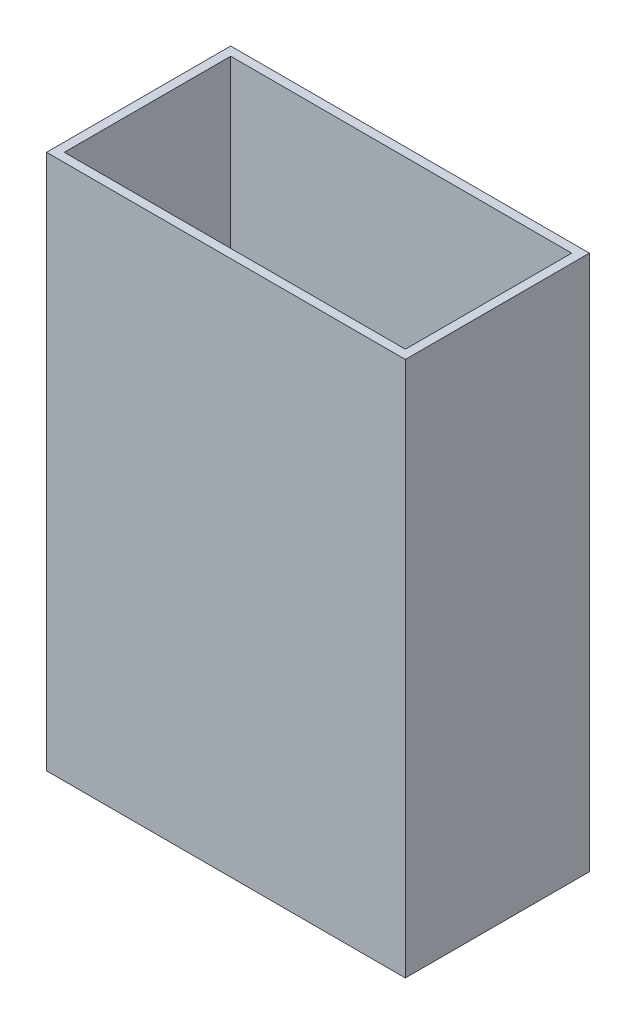
ISO-10303-21;
HEADER;
FILE_DESCRIPTION(('STEP AP214'),'2;1');
FILE_NAME('part.step','',(''),(''),'','','');
FILE_SCHEMA(('AUTOMOTIVE_DESIGN { 1 0 10303 214 1 1 1 1 }'));
ENDSEC;
DATA;
#1=APPLICATION_CONTEXT('core data for automotive mechanical design processes');
#2=APPLICATION_PROTOCOL_DEFINITION('international standard','automotive_design',2000,#1);
#3=PRODUCT_CONTEXT('',#1,'mechanical');
#4=PRODUCT('Part','Part','',(#3));
#5=PRODUCT_RELATED_PRODUCT_CATEGORY('part','',(#4));
#6=PRODUCT_DEFINITION_FORMATION('','',#4);
#7=PRODUCT_DEFINITION_CONTEXT('part definition',#1,'design');
#8=PRODUCT_DEFINITION('design','',#6,#7);
#9=PRODUCT_DEFINITION_SHAPE('','',#8);
#10=(LENGTH_UNIT() NAMED_UNIT(*) SI_UNIT(.MILLI.,.METRE.));
#11=(NAMED_UNIT(*) PLANE_ANGLE_UNIT() SI_UNIT($,.RADIAN.));
#12=(NAMED_UNIT(*) SI_UNIT($,.STERADIAN.) SOLID_ANGLE_UNIT());
#13=UNCERTAINTY_MEASURE_WITH_UNIT(LENGTH_MEASURE(1.E-05),#10,'distance_accuracy_value','');
#14=(GEOMETRIC_REPRESENTATION_CONTEXT(3) GLOBAL_UNCERTAINTY_ASSIGNED_CONTEXT((#13)) GLOBAL_UNIT_ASSIGNED_CONTEXT((#10,
#11,#12)) REPRESENTATION_CONTEXT('',''));
#15=CARTESIAN_POINT('',(0.,0.,0.));
#16=DIRECTION('',(0.,0.,1.));
#17=DIRECTION('',(1.,0.,0.));
#18=AXIS2_PLACEMENT_3D('',#15,#16,#17);
#19=CARTESIAN_POINT('',(0.,1.6,0.));
#20=DIRECTION('',(0.,1.,0.));
#21=DIRECTION('',(0.,0.,1.));
#22=AXIS2_PLACEMENT_3D('',#19,#20,#21);
#23=PLANE('',#22);
#24=DIRECTION('',(0.,0.,1.));
#25=VECTOR('',#24,1.);
#26=CARTESIAN_POINT('',(29.15,1.6,-3.));
#27=LINE('',#26,#25);
#28=CARTESIAN_POINT('',(29.15,1.6,-3.));
#29=VERTEX_POINT('',#28);
#30=CARTESIAN_POINT('',(29.15,1.6,-1.4));
#31=VERTEX_POINT('',#30);
#32=EDGE_CURVE('E692',#29,#31,#27,.T.);
#33=ORIENTED_EDGE('',*,*,#32,.F.);
#34=DIRECTION('',(-1.,0.,0.));
#35=VECTOR('',#34,1.);
#36=CARTESIAN_POINT('',(30.75,1.6,-3.));
#37=LINE('',#36,#35);
#38=CARTESIAN_POINT('',(30.75,1.6,-3.));
#39=VERTEX_POINT('',#38);
#40=EDGE_CURVE('E694',#39,#29,#37,.T.);
#41=ORIENTED_EDGE('',*,*,#40,.F.);
#42=DIRECTION('',(0.,0.,-1.));
#43=VECTOR('',#42,1.);
#44=CARTESIAN_POINT('',(30.75,1.6,-15.));
#45=LINE('',#44,#43);
#46=CARTESIAN_POINT('',(30.75,1.6,-15.));
#47=VERTEX_POINT('',#46);
#48=EDGE_CURVE('E221',#39,#47,#45,.T.);
#49=ORIENTED_EDGE('',*,*,#48,.T.);
#50=DIRECTION('',(-1.,0.,0.));
#51=VECTOR('',#50,1.);
#52=CARTESIAN_POINT('',(-30.75,1.6,-15.));
#53=LINE('',#52,#51);
#54=CARTESIAN_POINT('',(-30.75,1.6,-15.));
#55=VERTEX_POINT('',#54);
#56=EDGE_CURVE('E317',#47,#55,#53,.T.);
#57=ORIENTED_EDGE('',*,*,#56,.T.);
#58=DIRECTION('',(0.,0.,1.));
#59=VECTOR('',#58,1.);
#60=CARTESIAN_POINT('',(-30.75,1.6,-15.));
#61=LINE('',#60,#59);
#62=CARTESIAN_POINT('',(-30.75,1.6,-3.));
#63=VERTEX_POINT('',#62);
#64=EDGE_CURVE('E321',#55,#63,#61,.T.);
#65=ORIENTED_EDGE('',*,*,#64,.T.);
#66=DIRECTION('',(-1.,0.,0.));
#67=VECTOR('',#66,1.);
#68=CARTESIAN_POINT('',(-30.75,1.6,-3.));
#69=LINE('',#68,#67);
#70=CARTESIAN_POINT('',(-29.15,1.6,-3.));
#71=VERTEX_POINT('',#70);
#72=EDGE_CURVE('E282',#71,#63,#69,.T.);
#73=ORIENTED_EDGE('',*,*,#72,.F.);
#74=DIRECTION('',(0.,0.,-1.));
#75=VECTOR('',#74,1.);
#76=CARTESIAN_POINT('',(-29.15,1.6,-3.));
#77=LINE('',#76,#75);
#78=CARTESIAN_POINT('',(-29.15,1.6,-1.4));
#79=VERTEX_POINT('',#78);
#80=EDGE_CURVE('E290',#79,#71,#77,.T.);
#81=ORIENTED_EDGE('',*,*,#80,.F.);
#82=DIRECTION('',(1.,0.,0.));
#83=VECTOR('',#82,1.);
#84=CARTESIAN_POINT('',(-30.75,1.6,-1.4));
#85=LINE('',#84,#83);
#86=CARTESIAN_POINT('',(-30.75,1.6,-1.4));
#87=VERTEX_POINT('',#86);
#88=EDGE_CURVE('E277',#87,#79,#85,.T.);
#89=ORIENTED_EDGE('',*,*,#88,.F.);
#90=CARTESIAN_POINT('',(-30.75,1.6,0.600000000000003));
#91=VERTEX_POINT('',#90);
#92=EDGE_CURVE('E324',#87,#91,#61,.T.);
#93=ORIENTED_EDGE('',*,*,#92,.T.);
#94=DIRECTION('',(-1.,0.,0.));
#95=VECTOR('',#94,1.);
#96=CARTESIAN_POINT('',(-30.75,1.6,0.600000000000003));
#97=LINE('',#96,#95);
#98=CARTESIAN_POINT('',(-29.15,1.6,0.600000000000003));
#99=VERTEX_POINT('',#98);
#100=EDGE_CURVE('E256',#99,#91,#97,.T.);
#101=ORIENTED_EDGE('',*,*,#100,.F.);
#102=DIRECTION('',(0.,0.,-1.));
#103=VECTOR('',#102,1.);
#104=CARTESIAN_POINT('',(-29.15,1.6,0.600000000000003));
#105=LINE('',#104,#103);
#106=CARTESIAN_POINT('',(-29.15,1.6,2.2));
#107=VERTEX_POINT('',#106);
#108=EDGE_CURVE('E264',#107,#99,#105,.T.);
#109=ORIENTED_EDGE('',*,*,#108,.F.);
#110=DIRECTION('',(1.,0.,0.));
#111=VECTOR('',#110,1.);
#112=CARTESIAN_POINT('',(-30.75,1.6,2.2));
#113=LINE('',#112,#111);
#114=CARTESIAN_POINT('',(-30.75,1.6,2.2));
#115=VERTEX_POINT('',#114);
#116=EDGE_CURVE('E251',#115,#107,#113,.T.);
#117=ORIENTED_EDGE('',*,*,#116,.F.);
#118=CARTESIAN_POINT('',(-30.75,1.6,15.));
#119=VERTEX_POINT('',#118);
#120=EDGE_CURVE('E320',#115,#119,#61,.T.);
#121=ORIENTED_EDGE('',*,*,#120,.T.);
#122=DIRECTION('',(1.,0.,0.));
#123=VECTOR('',#122,1.);
#124=CARTESIAN_POINT('',(-30.75,1.6,15.));
#125=LINE('',#124,#123);
#126=CARTESIAN_POINT('',(30.75,1.6,15.));
#127=VERTEX_POINT('',#126);
#128=EDGE_CURVE('E306',#119,#127,#125,.T.);
#129=ORIENTED_EDGE('',*,*,#128,.T.);
#130=CARTESIAN_POINT('',(30.75,1.6,2.2));
#131=VERTEX_POINT('',#130);
#132=EDGE_CURVE('E314',#127,#131,#45,.T.);
#133=ORIENTED_EDGE('',*,*,#132,.T.);
#134=DIRECTION('',(1.,0.,0.));
#135=VECTOR('',#134,1.);
#136=CARTESIAN_POINT('',(30.75,1.6,2.2));
#137=LINE('',#136,#135);
#138=CARTESIAN_POINT('',(29.15,1.6,2.2));
#139=VERTEX_POINT('',#138);
#140=EDGE_CURVE('E234',#139,#131,#137,.T.);
#141=ORIENTED_EDGE('',*,*,#140,.F.);
#142=DIRECTION('',(0.,0.,1.));
#143=VECTOR('',#142,1.);
#144=CARTESIAN_POINT('',(29.15,1.6,0.600000000000003));
#145=LINE('',#144,#143);
#146=CARTESIAN_POINT('',(29.15,1.6,0.600000000000003));
#147=VERTEX_POINT('',#146);
#148=EDGE_CURVE('E224',#147,#139,#145,.T.);
#149=ORIENTED_EDGE('',*,*,#148,.F.);
#150=DIRECTION('',(-1.,0.,0.));
#151=VECTOR('',#150,1.);
#152=CARTESIAN_POINT('',(30.75,1.6,0.600000000000003));
#153=LINE('',#152,#151);
#154=CARTESIAN_POINT('',(30.75,1.6,0.600000000000003));
#155=VERTEX_POINT('',#154);
#156=EDGE_CURVE('E222',#155,#147,#153,.T.);
#157=ORIENTED_EDGE('',*,*,#156,.F.);
#158=CARTESIAN_POINT('',(30.75,1.6,-1.4));
#159=VERTEX_POINT('',#158);
#160=EDGE_CURVE('E318',#155,#159,#45,.T.);
#161=ORIENTED_EDGE('',*,*,#160,.T.);
#162=DIRECTION('',(1.,0.,0.));
#163=VECTOR('',#162,1.);
#164=CARTESIAN_POINT('',(30.75,1.6,-1.4));
#165=LINE('',#164,#163);
#166=EDGE_CURVE('E216',#31,#159,#165,.T.);
#167=ORIENTED_EDGE('',*,*,#166,.F.);
#168=EDGE_LOOP('',(#33,#41,#49,#57,#65,#73,#81,#89,#93,#101,#109,#117,#121,#129,#133,#141,#149,
#157,#161,#167));
#169=FACE_BOUND('',#168,.T.);
#170=ADVANCED_FACE('F37',(#169),#23,.T.);
#171=CARTESIAN_POINT('',(30.75,96.6,-15.));
#172=DIRECTION('',(-1.,0.,0.));
#173=DIRECTION('',(0.,0.,1.));
#174=AXIS2_PLACEMENT_3D('',#171,#172,#173);
#175=PLANE('',#174);
#176=ORIENTED_EDGE('',*,*,#48,.F.);
#177=DIRECTION('',(0.,-1.,0.));
#178=VECTOR('',#177,1.);
#179=CARTESIAN_POINT('',(30.75,61.6,-3.));
#180=LINE('',#179,#178);
#181=CARTESIAN_POINT('',(30.75,61.6,-3.));
#182=VERTEX_POINT('',#181);
#183=EDGE_CURVE('E203',#182,#39,#180,.T.);
#184=ORIENTED_EDGE('',*,*,#183,.F.);
#185=DIRECTION('',(0.,0.,-1.));
#186=VECTOR('',#185,1.);
#187=CARTESIAN_POINT('',(30.75,61.6,-3.));
#188=LINE('',#187,#186);
#189=CARTESIAN_POINT('',(30.75,61.6,-1.4));
#190=VERTEX_POINT('',#189);
#191=EDGE_CURVE('E210',#190,#182,#188,.T.);
#192=ORIENTED_EDGE('',*,*,#191,.F.);
#193=DIRECTION('',(0.,-1.,0.));
#194=VECTOR('',#193,1.);
#195=CARTESIAN_POINT('',(30.75,61.6,-1.4));
#196=LINE('',#195,#194);
#197=EDGE_CURVE('E52',#190,#159,#196,.T.);
#198=ORIENTED_EDGE('',*,*,#197,.T.);
#199=ORIENTED_EDGE('',*,*,#160,.F.);
#200=DIRECTION('',(0.,-1.,0.));
#201=VECTOR('',#200,1.);
#202=CARTESIAN_POINT('',(30.75,61.6,0.600000000000003));
#203=LINE('',#202,#201);
#204=CARTESIAN_POINT('',(30.75,61.6,0.600000000000003));
#205=VERTEX_POINT('',#204);
#206=EDGE_CURVE('E249',#205,#155,#203,.T.);
#207=ORIENTED_EDGE('',*,*,#206,.F.);
#208=DIRECTION('',(0.,0.,-1.));
#209=VECTOR('',#208,1.);
#210=CARTESIAN_POINT('',(30.75,61.6,0.600000000000003));
#211=LINE('',#210,#209);
#212=CARTESIAN_POINT('',(30.75,61.6,2.2));
#213=VERTEX_POINT('',#212);
#214=EDGE_CURVE('E230',#213,#205,#211,.T.);
#215=ORIENTED_EDGE('',*,*,#214,.F.);
#216=DIRECTION('',(0.,-1.,0.));
#217=VECTOR('',#216,1.);
#218=CARTESIAN_POINT('',(30.75,61.6,2.2));
#219=LINE('',#218,#217);
#220=EDGE_CURVE('E60',#213,#131,#219,.T.);
#221=ORIENTED_EDGE('',*,*,#220,.T.);
#222=ORIENTED_EDGE('',*,*,#132,.F.);
#223=DIRECTION('',(0.,-1.,0.));
#224=VECTOR('',#223,1.);
#225=CARTESIAN_POINT('',(30.75,96.6,15.));
#226=LINE('',#225,#224);
#227=CARTESIAN_POINT('',(30.75,96.6,15.));
#228=VERTEX_POINT('',#227);
#229=EDGE_CURVE('E313',#228,#127,#226,.T.);
#230=ORIENTED_EDGE('',*,*,#229,.F.);
#231=DIRECTION('',(0.,0.,-1.));
#232=VECTOR('',#231,1.);
#233=CARTESIAN_POINT('',(30.75,96.6,-15.));
#234=LINE('',#233,#232);
#235=CARTESIAN_POINT('',(30.75,96.6,-15.));
#236=VERTEX_POINT('',#235);
#237=EDGE_CURVE('E303',#228,#236,#234,.T.);
#238=ORIENTED_EDGE('',*,*,#237,.T.);
#239=DIRECTION('',(0.,-1.,0.));
#240=VECTOR('',#239,1.);
#241=CARTESIAN_POINT('',(30.75,96.6,-15.));
#242=LINE('',#241,#240);
#243=EDGE_CURVE('E334',#236,#47,#242,.T.);
#244=ORIENTED_EDGE('',*,*,#243,.T.);
#245=EDGE_LOOP('',(#176,#184,#192,#198,#199,#207,#215,#221,#222,#230,#238,#244));
#246=FACE_BOUND('',#245,.T.);
#247=ADVANCED_FACE('F219',(#246),#175,.T.);
#248=CARTESIAN_POINT('',(-30.75,96.6,-15.));
#249=DIRECTION('',(1.,0.,0.));
#250=DIRECTION('',(0.,0.,-1.));
#251=AXIS2_PLACEMENT_3D('',#248,#249,#250);
#252=PLANE('',#251);
#253=ORIENTED_EDGE('',*,*,#120,.F.);
#254=DIRECTION('',(0.,-1.,0.));
#255=VECTOR('',#254,1.);
#256=CARTESIAN_POINT('',(-30.75,61.6,2.2));
#257=LINE('',#256,#255);
#258=CARTESIAN_POINT('',(-30.75,61.6,2.2));
#259=VERTEX_POINT('',#258);
#260=EDGE_CURVE('E275',#259,#115,#257,.T.);
#261=ORIENTED_EDGE('',*,*,#260,.F.);
#262=DIRECTION('',(0.,0.,1.));
#263=VECTOR('',#262,1.);
#264=CARTESIAN_POINT('',(-30.75,61.6,0.600000000000003));
#265=LINE('',#264,#263);
#266=CARTESIAN_POINT('',(-30.75,61.6,0.600000000000003));
#267=VERTEX_POINT('',#266);
#268=EDGE_CURVE('E252',#267,#259,#265,.T.);
#269=ORIENTED_EDGE('',*,*,#268,.F.);
#270=DIRECTION('',(0.,-1.,0.));
#271=VECTOR('',#270,1.);
#272=CARTESIAN_POINT('',(-30.75,61.6,0.600000000000003));
#273=LINE('',#272,#271);
#274=EDGE_CURVE('E262',#267,#91,#273,.T.);
#275=ORIENTED_EDGE('',*,*,#274,.T.);
#276=ORIENTED_EDGE('',*,*,#92,.F.);
#277=DIRECTION('',(0.,-1.,0.));
#278=VECTOR('',#277,1.);
#279=CARTESIAN_POINT('',(-30.75,61.6,-1.4));
#280=LINE('',#279,#278);
#281=CARTESIAN_POINT('',(-30.75,61.6,-1.4));
#282=VERTEX_POINT('',#281);
#283=EDGE_CURVE('E301',#282,#87,#280,.T.);
#284=ORIENTED_EDGE('',*,*,#283,.F.);
#285=DIRECTION('',(0.,0.,1.));
#286=VECTOR('',#285,1.);
#287=CARTESIAN_POINT('',(-30.75,61.6,-3.));
#288=LINE('',#287,#286);
#289=CARTESIAN_POINT('',(-30.75,61.6,-3.));
#290=VERTEX_POINT('',#289);
#291=EDGE_CURVE('E278',#290,#282,#288,.T.);
#292=ORIENTED_EDGE('',*,*,#291,.F.);
#293=DIRECTION('',(0.,-1.,0.));
#294=VECTOR('',#293,1.);
#295=CARTESIAN_POINT('',(-30.75,61.6,-3.));
#296=LINE('',#295,#294);
#297=EDGE_CURVE('E288',#290,#63,#296,.T.);
#298=ORIENTED_EDGE('',*,*,#297,.T.);
#299=ORIENTED_EDGE('',*,*,#64,.F.);
#300=DIRECTION('',(0.,-1.,0.));
#301=VECTOR('',#300,1.);
#302=CARTESIAN_POINT('',(-30.75,96.6,-15.));
#303=LINE('',#302,#301);
#304=CARTESIAN_POINT('',(-30.75,96.6,-15.));
#305=VERTEX_POINT('',#304);
#306=EDGE_CURVE('E331',#305,#55,#303,.T.);
#307=ORIENTED_EDGE('',*,*,#306,.F.);
#308=DIRECTION('',(0.,0.,1.));
#309=VECTOR('',#308,1.);
#310=CARTESIAN_POINT('',(-30.75,96.6,-15.));
#311=LINE('',#310,#309);
#312=CARTESIAN_POINT('',(-30.75,96.6,15.));
#313=VERTEX_POINT('',#312);
#314=EDGE_CURVE('E308',#305,#313,#311,.T.);
#315=ORIENTED_EDGE('',*,*,#314,.T.);
#316=DIRECTION('',(0.,-1.,0.));
#317=VECTOR('',#316,1.);
#318=CARTESIAN_POINT('',(-30.75,96.6,15.));
#319=LINE('',#318,#317);
#320=EDGE_CURVE('E328',#313,#119,#319,.T.);
#321=ORIENTED_EDGE('',*,*,#320,.T.);
#322=EDGE_LOOP('',(#253,#261,#269,#275,#276,#284,#292,#298,#299,#307,#315,#321));
#323=FACE_BOUND('',#322,.T.);
#324=ADVANCED_FACE('F388',(#323),#252,.T.);
#325=CARTESIAN_POINT('',(32.35,1.6,-16.6));
#326=DIRECTION('',(-1.,0.,0.));
#327=DIRECTION('',(0.,0.,1.));
#328=AXIS2_PLACEMENT_3D('',#325,#326,#327);
#329=PLANE('',#328);
#330=DIRECTION('',(0.,0.,-1.));
#331=VECTOR('',#330,1.);
#332=CARTESIAN_POINT('',(32.35,0.,-16.6));
#333=LINE('',#332,#331);
#334=CARTESIAN_POINT('',(32.35,0.,16.6));
#335=VERTEX_POINT('',#334);
#336=CARTESIAN_POINT('',(32.35,0.,-16.6));
#337=VERTEX_POINT('',#336);
#338=EDGE_CURVE('E348',#335,#337,#333,.T.);
#339=ORIENTED_EDGE('',*,*,#338,.T.);
#340=DIRECTION('',(0.,-1.,0.));
#341=VECTOR('',#340,1.);
#342=CARTESIAN_POINT('',(32.35,1.6,-16.6));
#343=LINE('',#342,#341);
#344=CARTESIAN_POINT('',(32.35,96.6,-16.6));
#345=VERTEX_POINT('',#344);
#346=EDGE_CURVE('E11',#345,#337,#343,.T.);
#347=ORIENTED_EDGE('',*,*,#346,.F.);
#348=DIRECTION('',(0.,0.,-1.));
#349=VECTOR('',#348,1.);
#350=CARTESIAN_POINT('',(32.35,96.6,-16.6));
#351=LINE('',#350,#349);
#352=CARTESIAN_POINT('',(32.35,96.6,16.6));
#353=VERTEX_POINT('',#352);
#354=EDGE_CURVE('E342',#353,#345,#351,.T.);
#355=ORIENTED_EDGE('',*,*,#354,.F.);
#356=DIRECTION('',(0.,-1.,0.));
#357=VECTOR('',#356,1.);
#358=CARTESIAN_POINT('',(32.35,1.6,16.6));
#359=LINE('',#358,#357);
#360=EDGE_CURVE('E357',#353,#335,#359,.T.);
#361=ORIENTED_EDGE('',*,*,#360,.T.);
#362=EDGE_LOOP('',(#339,#347,#355,#361));
#363=FACE_BOUND('',#362,.T.);
#364=ADVANCED_FACE('F39',(#363),#329,.F.);
#365=CARTESIAN_POINT('',(-32.35,1.6,-16.6));
#366=DIRECTION('',(0.,0.,1.));
#367=DIRECTION('',(1.,0.,0.));
#368=AXIS2_PLACEMENT_3D('',#365,#366,#367);
#369=PLANE('',#368);
#370=DIRECTION('',(-1.,0.,0.));
#371=VECTOR('',#370,1.);
#372=CARTESIAN_POINT('',(-32.35,0.,-16.6));
#373=LINE('',#372,#371);
#374=CARTESIAN_POINT('',(-32.35,0.,-16.6));
#375=VERTEX_POINT('',#374);
#376=EDGE_CURVE('E351',#337,#375,#373,.T.);
#377=ORIENTED_EDGE('',*,*,#376,.T.);
#378=DIRECTION('',(0.,-1.,0.));
#379=VECTOR('',#378,1.);
#380=CARTESIAN_POINT('',(-32.35,1.6,-16.6));
#381=LINE('',#380,#379);
#382=CARTESIAN_POINT('',(-32.35,96.6,-16.6));
#383=VERTEX_POINT('',#382);
#384=EDGE_CURVE('E45',#383,#375,#381,.T.);
#385=ORIENTED_EDGE('',*,*,#384,.F.);
#386=DIRECTION('',(-1.,0.,0.));
#387=VECTOR('',#386,1.);
#388=CARTESIAN_POINT('',(-32.35,96.6,-16.6));
#389=LINE('',#388,#387);
#390=EDGE_CURVE('E345',#345,#383,#389,.T.);
#391=ORIENTED_EDGE('',*,*,#390,.F.);
#392=ORIENTED_EDGE('',*,*,#346,.T.);
#393=EDGE_LOOP('',(#377,#385,#391,#392));
#394=FACE_BOUND('',#393,.T.);
#395=ADVANCED_FACE('F381',(#394),#369,.F.);
#396=CARTESIAN_POINT('',(-32.35,1.6,-16.6));
#397=DIRECTION('',(1.,0.,0.));
#398=DIRECTION('',(0.,0.,-1.));
#399=AXIS2_PLACEMENT_3D('',#396,#397,#398);
#400=PLANE('',#399);
#401=DIRECTION('',(0.,0.,1.));
#402=VECTOR('',#401,1.);
#403=CARTESIAN_POINT('',(-32.35,0.,-16.6));
#404=LINE('',#403,#402);
#405=CARTESIAN_POINT('',(-32.35,0.,16.6));
#406=VERTEX_POINT('',#405);
#407=EDGE_CURVE('E353',#375,#406,#404,.T.);
#408=ORIENTED_EDGE('',*,*,#407,.T.);
#409=DIRECTION('',(0.,-1.,0.));
#410=VECTOR('',#409,1.);
#411=CARTESIAN_POINT('',(-32.35,1.6,16.6));
#412=LINE('',#411,#410);
#413=CARTESIAN_POINT('',(-32.35,96.6,16.6));
#414=VERTEX_POINT('',#413);
#415=EDGE_CURVE('E360',#414,#406,#412,.T.);
#416=ORIENTED_EDGE('',*,*,#415,.F.);
#417=DIRECTION('',(0.,0.,1.));
#418=VECTOR('',#417,1.);
#419=CARTESIAN_POINT('',(-32.35,96.6,-16.6));
#420=LINE('',#419,#418);
#421=EDGE_CURVE('E336',#383,#414,#420,.T.);
#422=ORIENTED_EDGE('',*,*,#421,.F.);
#423=ORIENTED_EDGE('',*,*,#384,.T.);
#424=EDGE_LOOP('',(#408,#416,#422,#423));
#425=FACE_BOUND('',#424,.T.);
#426=ADVANCED_FACE('F366',(#425),#400,.F.);
#427=CARTESIAN_POINT('',(-32.35,1.6,16.6));
#428=DIRECTION('',(0.,0.,-1.));
#429=DIRECTION('',(-1.,0.,0.));
#430=AXIS2_PLACEMENT_3D('',#427,#428,#429);
#431=PLANE('',#430);
#432=DIRECTION('',(1.,0.,0.));
#433=VECTOR('',#432,1.);
#434=CARTESIAN_POINT('',(-32.35,0.,16.6));
#435=LINE('',#434,#433);
#436=EDGE_CURVE('E355',#406,#335,#435,.T.);
#437=ORIENTED_EDGE('',*,*,#436,.T.);
#438=ORIENTED_EDGE('',*,*,#360,.F.);
#439=DIRECTION('',(1.,0.,0.));
#440=VECTOR('',#439,1.);
#441=CARTESIAN_POINT('',(-32.35,96.6,16.6));
#442=LINE('',#441,#440);
#443=EDGE_CURVE('E339',#414,#353,#442,.T.);
#444=ORIENTED_EDGE('',*,*,#443,.F.);
#445=ORIENTED_EDGE('',*,*,#415,.T.);
#446=EDGE_LOOP('',(#437,#438,#444,#445));
#447=FACE_BOUND('',#446,.T.);
#448=ADVANCED_FACE('F374',(#447),#431,.F.);
#449=CARTESIAN_POINT('',(0.,0.,0.));
#450=DIRECTION('',(0.,1.,0.));
#451=DIRECTION('',(0.,0.,1.));
#452=AXIS2_PLACEMENT_3D('',#449,#450,#451);
#453=PLANE('',#452);
#454=ORIENTED_EDGE('',*,*,#338,.F.);
#455=ORIENTED_EDGE('',*,*,#436,.F.);
#456=ORIENTED_EDGE('',*,*,#407,.F.);
#457=ORIENTED_EDGE('',*,*,#376,.F.);
#458=EDGE_LOOP('',(#454,#455,#456,#457));
#459=FACE_BOUND('',#458,.T.);
#460=ADVANCED_FACE('F372',(#459),#453,.F.);
#461=CARTESIAN_POINT('',(0.,96.6,0.));
#462=DIRECTION('',(0.,1.,0.));
#463=DIRECTION('',(0.,0.,1.));
#464=AXIS2_PLACEMENT_3D('',#461,#462,#463);
#465=PLANE('',#464);
#466=ORIENTED_EDGE('',*,*,#421,.T.);
#467=ORIENTED_EDGE('',*,*,#443,.T.);
#468=ORIENTED_EDGE('',*,*,#354,.T.);
#469=ORIENTED_EDGE('',*,*,#390,.T.);
#470=EDGE_LOOP('',(#466,#467,#468,#469));
#471=FACE_BOUND('',#470,.T.);
#472=DIRECTION('',(-1.,0.,0.));
#473=VECTOR('',#472,1.);
#474=CARTESIAN_POINT('',(-30.75,96.6,-15.));
#475=LINE('',#474,#473);
#476=EDGE_CURVE('E305',#236,#305,#475,.T.);
#477=ORIENTED_EDGE('',*,*,#476,.F.);
#478=ORIENTED_EDGE('',*,*,#237,.F.);
#479=DIRECTION('',(1.,0.,0.));
#480=VECTOR('',#479,1.);
#481=CARTESIAN_POINT('',(-30.75,96.6,15.));
#482=LINE('',#481,#480);
#483=EDGE_CURVE('E311',#313,#228,#482,.T.);
#484=ORIENTED_EDGE('',*,*,#483,.F.);
#485=ORIENTED_EDGE('',*,*,#314,.F.);
#486=EDGE_LOOP('',(#477,#478,#484,#485));
#487=FACE_BOUND('',#486,.T.);
#488=ADVANCED_FACE('F379',(#471,#487),#465,.T.);
#489=CARTESIAN_POINT('',(-30.75,96.6,-15.));
#490=DIRECTION('',(0.,0.,1.));
#491=DIRECTION('',(1.,0.,0.));
#492=AXIS2_PLACEMENT_3D('',#489,#490,#491);
#493=PLANE('',#492);
#494=ORIENTED_EDGE('',*,*,#56,.F.);
#495=ORIENTED_EDGE('',*,*,#243,.F.);
#496=ORIENTED_EDGE('',*,*,#476,.T.);
#497=ORIENTED_EDGE('',*,*,#306,.T.);
#498=EDGE_LOOP('',(#494,#495,#496,#497));
#499=FACE_BOUND('',#498,.T.);
#500=ADVANCED_FACE('F417',(#499),#493,.T.);
#501=CARTESIAN_POINT('',(-30.75,96.6,15.));
#502=DIRECTION('',(0.,0.,-1.));
#503=DIRECTION('',(-1.,0.,0.));
#504=AXIS2_PLACEMENT_3D('',#501,#502,#503);
#505=PLANE('',#504);
#506=ORIENTED_EDGE('',*,*,#128,.F.);
#507=ORIENTED_EDGE('',*,*,#320,.F.);
#508=ORIENTED_EDGE('',*,*,#483,.T.);
#509=ORIENTED_EDGE('',*,*,#229,.T.);
#510=EDGE_LOOP('',(#506,#507,#508,#509));
#511=FACE_BOUND('',#510,.T.);
#512=ADVANCED_FACE('F423',(#511),#505,.T.);
#513=CARTESIAN_POINT('',(-30.75,61.6,-1.4));
#514=DIRECTION('',(0.,0.,-1.));
#515=DIRECTION('',(-1.,0.,0.));
#516=AXIS2_PLACEMENT_3D('',#513,#514,#515);
#517=PLANE('',#516);
#518=ORIENTED_EDGE('',*,*,#88,.T.);
#519=DIRECTION('',(0.,-1.,0.));
#520=VECTOR('',#519,1.);
#521=CARTESIAN_POINT('',(-29.15,61.6,-1.4));
#522=LINE('',#521,#520);
#523=CARTESIAN_POINT('',(-29.15,61.6,-1.4));
#524=VERTEX_POINT('',#523);
#525=EDGE_CURVE('E298',#524,#79,#522,.T.);
#526=ORIENTED_EDGE('',*,*,#525,.F.);
#527=DIRECTION('',(1.,0.,0.));
#528=VECTOR('',#527,1.);
#529=CARTESIAN_POINT('',(-30.75,61.6,-1.4));
#530=LINE('',#529,#528);
#531=EDGE_CURVE('E281',#282,#524,#530,.T.);
#532=ORIENTED_EDGE('',*,*,#531,.F.);
#533=ORIENTED_EDGE('',*,*,#283,.T.);
#534=EDGE_LOOP('',(#518,#526,#532,#533));
#535=FACE_BOUND('',#534,.T.);
#536=ADVANCED_FACE('F431',(#535),#517,.F.);
#537=CARTESIAN_POINT('',(-29.15,61.6,-3.));
#538=DIRECTION('',(-1.,0.,0.));
#539=DIRECTION('',(0.,0.,1.));
#540=AXIS2_PLACEMENT_3D('',#537,#538,#539);
#541=PLANE('',#540);
#542=ORIENTED_EDGE('',*,*,#80,.T.);
#543=DIRECTION('',(0.,-1.,0.));
#544=VECTOR('',#543,1.);
#545=CARTESIAN_POINT('',(-29.15,61.6,-3.));
#546=LINE('',#545,#544);
#547=CARTESIAN_POINT('',(-29.15,61.6,-3.));
#548=VERTEX_POINT('',#547);
#549=EDGE_CURVE('E296',#548,#71,#546,.T.);
#550=ORIENTED_EDGE('',*,*,#549,.F.);
#551=DIRECTION('',(0.,0.,-1.));
#552=VECTOR('',#551,1.);
#553=CARTESIAN_POINT('',(-29.15,61.6,-3.));
#554=LINE('',#553,#552);
#555=EDGE_CURVE('E284',#524,#548,#554,.T.);
#556=ORIENTED_EDGE('',*,*,#555,.F.);
#557=ORIENTED_EDGE('',*,*,#525,.T.);
#558=EDGE_LOOP('',(#542,#550,#556,#557));
#559=FACE_BOUND('',#558,.T.);
#560=ADVANCED_FACE('F439',(#559),#541,.F.);
#561=CARTESIAN_POINT('',(-30.75,61.6,-3.));
#562=DIRECTION('',(0.,0.,1.));
#563=DIRECTION('',(1.,0.,0.));
#564=AXIS2_PLACEMENT_3D('',#561,#562,#563);
#565=PLANE('',#564);
#566=ORIENTED_EDGE('',*,*,#72,.T.);
#567=ORIENTED_EDGE('',*,*,#297,.F.);
#568=DIRECTION('',(-1.,0.,0.));
#569=VECTOR('',#568,1.);
#570=CARTESIAN_POINT('',(-30.75,61.6,-3.));
#571=LINE('',#570,#569);
#572=EDGE_CURVE('E286',#548,#290,#571,.T.);
#573=ORIENTED_EDGE('',*,*,#572,.F.);
#574=ORIENTED_EDGE('',*,*,#549,.T.);
#575=EDGE_LOOP('',(#566,#567,#573,#574));
#576=FACE_BOUND('',#575,.T.);
#577=ADVANCED_FACE('F448',(#576),#565,.F.);
#578=CARTESIAN_POINT('',(0.,61.6,0.));
#579=DIRECTION('',(0.,1.,0.));
#580=DIRECTION('',(0.,0.,1.));
#581=AXIS2_PLACEMENT_3D('',#578,#579,#580);
#582=PLANE('',#581);
#583=ORIENTED_EDGE('',*,*,#291,.T.);
#584=ORIENTED_EDGE('',*,*,#531,.T.);
#585=ORIENTED_EDGE('',*,*,#555,.T.);
#586=ORIENTED_EDGE('',*,*,#572,.T.);
#587=EDGE_LOOP('',(#583,#584,#585,#586));
#588=FACE_BOUND('',#587,.T.);
#589=ADVANCED_FACE('F456',(#588),#582,.T.);
#590=CARTESIAN_POINT('',(-30.75,61.6,2.2));
#591=DIRECTION('',(0.,0.,-1.));
#592=DIRECTION('',(-1.,0.,0.));
#593=AXIS2_PLACEMENT_3D('',#590,#591,#592);
#594=PLANE('',#593);
#595=ORIENTED_EDGE('',*,*,#116,.T.);
#596=DIRECTION('',(0.,-1.,0.));
#597=VECTOR('',#596,1.);
#598=CARTESIAN_POINT('',(-29.15,61.6,2.2));
#599=LINE('',#598,#597);
#600=CARTESIAN_POINT('',(-29.15,61.6,2.2));
#601=VERTEX_POINT('',#600);
#602=EDGE_CURVE('E272',#601,#107,#599,.T.);
#603=ORIENTED_EDGE('',*,*,#602,.F.);
#604=DIRECTION('',(1.,0.,0.));
#605=VECTOR('',#604,1.);
#606=CARTESIAN_POINT('',(-30.75,61.6,2.2));
#607=LINE('',#606,#605);
#608=EDGE_CURVE('E255',#259,#601,#607,.T.);
#609=ORIENTED_EDGE('',*,*,#608,.F.);
#610=ORIENTED_EDGE('',*,*,#260,.T.);
#611=EDGE_LOOP('',(#595,#603,#609,#610));
#612=FACE_BOUND('',#611,.T.);
#613=ADVANCED_FACE('F464',(#612),#594,.F.);
#614=CARTESIAN_POINT('',(-29.15,61.6,0.600000000000003));
#615=DIRECTION('',(-1.,0.,0.));
#616=DIRECTION('',(0.,0.,1.));
#617=AXIS2_PLACEMENT_3D('',#614,#615,#616);
#618=PLANE('',#617);
#619=ORIENTED_EDGE('',*,*,#108,.T.);
#620=DIRECTION('',(0.,-1.,0.));
#621=VECTOR('',#620,1.);
#622=CARTESIAN_POINT('',(-29.15,61.6,0.600000000000003));
#623=LINE('',#622,#621);
#624=CARTESIAN_POINT('',(-29.15,61.6,0.600000000000003));
#625=VERTEX_POINT('',#624);
#626=EDGE_CURVE('E270',#625,#99,#623,.T.);
#627=ORIENTED_EDGE('',*,*,#626,.F.);
#628=DIRECTION('',(0.,0.,-1.));
#629=VECTOR('',#628,1.);
#630=CARTESIAN_POINT('',(-29.15,61.6,0.600000000000003));
#631=LINE('',#630,#629);
#632=EDGE_CURVE('E258',#601,#625,#631,.T.);
#633=ORIENTED_EDGE('',*,*,#632,.F.);
#634=ORIENTED_EDGE('',*,*,#602,.T.);
#635=EDGE_LOOP('',(#619,#627,#633,#634));
#636=FACE_BOUND('',#635,.T.);
#637=ADVANCED_FACE('F472',(#636),#618,.F.);
#638=CARTESIAN_POINT('',(-30.75,61.6,0.600000000000003));
#639=DIRECTION('',(0.,0.,1.));
#640=DIRECTION('',(1.,0.,0.));
#641=AXIS2_PLACEMENT_3D('',#638,#639,#640);
#642=PLANE('',#641);
#643=ORIENTED_EDGE('',*,*,#100,.T.);
#644=ORIENTED_EDGE('',*,*,#274,.F.);
#645=DIRECTION('',(-1.,0.,0.));
#646=VECTOR('',#645,1.);
#647=CARTESIAN_POINT('',(-30.75,61.6,0.600000000000003));
#648=LINE('',#647,#646);
#649=EDGE_CURVE('E260',#625,#267,#648,.T.);
#650=ORIENTED_EDGE('',*,*,#649,.F.);
#651=ORIENTED_EDGE('',*,*,#626,.T.);
#652=EDGE_LOOP('',(#643,#644,#650,#651));
#653=FACE_BOUND('',#652,.T.);
#654=ADVANCED_FACE('F480',(#653),#642,.F.);
#655=CARTESIAN_POINT('',(0.,61.6,0.));
#656=DIRECTION('',(0.,1.,0.));
#657=DIRECTION('',(0.,0.,1.));
#658=AXIS2_PLACEMENT_3D('',#655,#656,#657);
#659=PLANE('',#658);
#660=ORIENTED_EDGE('',*,*,#268,.T.);
#661=ORIENTED_EDGE('',*,*,#608,.T.);
#662=ORIENTED_EDGE('',*,*,#632,.T.);
#663=ORIENTED_EDGE('',*,*,#649,.T.);
#664=EDGE_LOOP('',(#660,#661,#662,#663));
#665=FACE_BOUND('',#664,.T.);
#666=ADVANCED_FACE('F488',(#665),#659,.T.);
#667=CARTESIAN_POINT('',(30.75,61.6,0.600000000000003));
#668=DIRECTION('',(0.,0.,1.));
#669=DIRECTION('',(1.,0.,0.));
#670=AXIS2_PLACEMENT_3D('',#667,#668,#669);
#671=PLANE('',#670);
#672=ORIENTED_EDGE('',*,*,#156,.T.);
#673=DIRECTION('',(0.,-1.,0.));
#674=VECTOR('',#673,1.);
#675=CARTESIAN_POINT('',(29.15,61.6,0.600000000000003));
#676=LINE('',#675,#674);
#677=CARTESIAN_POINT('',(29.15,61.6,0.600000000000003));
#678=VERTEX_POINT('',#677);
#679=EDGE_CURVE('E246',#678,#147,#676,.T.);
#680=ORIENTED_EDGE('',*,*,#679,.F.);
#681=DIRECTION('',(-1.,0.,0.));
#682=VECTOR('',#681,1.);
#683=CARTESIAN_POINT('',(30.75,61.6,0.600000000000003));
#684=LINE('',#683,#682);
#685=EDGE_CURVE('E233',#205,#678,#684,.T.);
#686=ORIENTED_EDGE('',*,*,#685,.F.);
#687=ORIENTED_EDGE('',*,*,#206,.T.);
#688=EDGE_LOOP('',(#672,#680,#686,#687));
#689=FACE_BOUND('',#688,.T.);
#690=ADVANCED_FACE('F496',(#689),#671,.F.);
#691=CARTESIAN_POINT('',(29.15,61.6,0.600000000000003));
#692=DIRECTION('',(1.,0.,0.));
#693=DIRECTION('',(0.,0.,-1.));
#694=AXIS2_PLACEMENT_3D('',#691,#692,#693);
#695=PLANE('',#694);
#696=ORIENTED_EDGE('',*,*,#148,.T.);
#697=DIRECTION('',(0.,-1.,0.));
#698=VECTOR('',#697,1.);
#699=CARTESIAN_POINT('',(29.15,61.6,2.2));
#700=LINE('',#699,#698);
#701=CARTESIAN_POINT('',(29.15,61.6,2.2));
#702=VERTEX_POINT('',#701);
#703=EDGE_CURVE('E243',#702,#139,#700,.T.);
#704=ORIENTED_EDGE('',*,*,#703,.F.);
#705=DIRECTION('',(0.,0.,1.));
#706=VECTOR('',#705,1.);
#707=CARTESIAN_POINT('',(29.15,61.6,0.600000000000003));
#708=LINE('',#707,#706);
#709=EDGE_CURVE('E236',#678,#702,#708,.T.);
#710=ORIENTED_EDGE('',*,*,#709,.F.);
#711=ORIENTED_EDGE('',*,*,#679,.T.);
#712=EDGE_LOOP('',(#696,#704,#710,#711));
#713=FACE_BOUND('',#712,.T.);
#714=ADVANCED_FACE('F504',(#713),#695,.F.);
#715=CARTESIAN_POINT('',(30.75,61.6,2.2));
#716=DIRECTION('',(0.,0.,-1.));
#717=DIRECTION('',(-1.,0.,0.));
#718=AXIS2_PLACEMENT_3D('',#715,#716,#717);
#719=PLANE('',#718);
#720=ORIENTED_EDGE('',*,*,#140,.T.);
#721=ORIENTED_EDGE('',*,*,#220,.F.);
#722=DIRECTION('',(1.,0.,0.));
#723=VECTOR('',#722,1.);
#724=CARTESIAN_POINT('',(30.75,61.6,2.2));
#725=LINE('',#724,#723);
#726=EDGE_CURVE('E238',#702,#213,#725,.T.);
#727=ORIENTED_EDGE('',*,*,#726,.F.);
#728=ORIENTED_EDGE('',*,*,#703,.T.);
#729=EDGE_LOOP('',(#720,#721,#727,#728));
#730=FACE_BOUND('',#729,.T.);
#731=ADVANCED_FACE('F512',(#730),#719,.F.);
#732=CARTESIAN_POINT('',(0.,61.6,0.));
#733=DIRECTION('',(0.,-1.,0.));
#734=DIRECTION('',(0.,0.,-1.));
#735=AXIS2_PLACEMENT_3D('',#732,#733,#734);
#736=PLANE('',#735);
#737=ORIENTED_EDGE('',*,*,#214,.T.);
#738=ORIENTED_EDGE('',*,*,#685,.T.);
#739=ORIENTED_EDGE('',*,*,#709,.T.);
#740=ORIENTED_EDGE('',*,*,#726,.T.);
#741=EDGE_LOOP('',(#737,#738,#739,#740));
#742=FACE_BOUND('',#741,.T.);
#743=ADVANCED_FACE('F520',(#742),#736,.F.);
#744=CARTESIAN_POINT('',(30.75,61.6,-3.));
#745=DIRECTION('',(0.,0.,1.));
#746=DIRECTION('',(1.,0.,0.));
#747=AXIS2_PLACEMENT_3D('',#744,#745,#746);
#748=PLANE('',#747);
#749=ORIENTED_EDGE('',*,*,#40,.T.);
#750=DIRECTION('',(0.,-1.,0.));
#751=VECTOR('',#750,1.);
#752=CARTESIAN_POINT('',(29.15,61.6,-3.));
#753=LINE('',#752,#751);
#754=CARTESIAN_POINT('',(29.15,61.6,-3.));
#755=VERTEX_POINT('',#754);
#756=EDGE_CURVE('E206',#755,#29,#753,.T.);
#757=ORIENTED_EDGE('',*,*,#756,.F.);
#758=DIRECTION('',(-1.,0.,0.));
#759=VECTOR('',#758,1.);
#760=CARTESIAN_POINT('',(30.75,61.6,-3.));
#761=LINE('',#760,#759);
#762=EDGE_CURVE('E199',#182,#755,#761,.T.);
#763=ORIENTED_EDGE('',*,*,#762,.F.);
#764=ORIENTED_EDGE('',*,*,#183,.T.);
#765=EDGE_LOOP('',(#749,#757,#763,#764));
#766=FACE_BOUND('',#765,.T.);
#767=ADVANCED_FACE('F201',(#766),#748,.F.);
#768=CARTESIAN_POINT('',(29.15,61.6,-3.));
#769=DIRECTION('',(1.,0.,0.));
#770=DIRECTION('',(0.,0.,-1.));
#771=AXIS2_PLACEMENT_3D('',#768,#769,#770);
#772=PLANE('',#771);
#773=ORIENTED_EDGE('',*,*,#32,.T.);
#774=DIRECTION('',(0.,-1.,0.));
#775=VECTOR('',#774,1.);
#776=CARTESIAN_POINT('',(29.15,61.6,-1.4));
#777=LINE('',#776,#775);
#778=CARTESIAN_POINT('',(29.15,61.6,-1.4));
#779=VERTEX_POINT('',#778);
#780=EDGE_CURVE('E226',#779,#31,#777,.T.);
#781=ORIENTED_EDGE('',*,*,#780,.F.);
#782=DIRECTION('',(0.,0.,1.));
#783=VECTOR('',#782,1.);
#784=CARTESIAN_POINT('',(29.15,61.6,-3.));
#785=LINE('',#784,#783);
#786=EDGE_CURVE('E209',#755,#779,#785,.T.);
#787=ORIENTED_EDGE('',*,*,#786,.F.);
#788=ORIENTED_EDGE('',*,*,#756,.T.);
#789=EDGE_LOOP('',(#773,#781,#787,#788));
#790=FACE_BOUND('',#789,.T.);
#791=ADVANCED_FACE('F534',(#790),#772,.F.);
#792=CARTESIAN_POINT('',(30.75,61.6,-1.4));
#793=DIRECTION('',(0.,0.,-1.));
#794=DIRECTION('',(-1.,0.,0.));
#795=AXIS2_PLACEMENT_3D('',#792,#793,#794);
#796=PLANE('',#795);
#797=ORIENTED_EDGE('',*,*,#166,.T.);
#798=ORIENTED_EDGE('',*,*,#197,.F.);
#799=DIRECTION('',(1.,0.,0.));
#800=VECTOR('',#799,1.);
#801=CARTESIAN_POINT('',(30.75,61.6,-1.4));
#802=LINE('',#801,#800);
#803=EDGE_CURVE('E214',#779,#190,#802,.T.);
#804=ORIENTED_EDGE('',*,*,#803,.F.);
#805=ORIENTED_EDGE('',*,*,#780,.T.);
#806=EDGE_LOOP('',(#797,#798,#804,#805));
#807=FACE_BOUND('',#806,.T.);
#808=ADVANCED_FACE('F541',(#807),#796,.F.);
#809=CARTESIAN_POINT('',(0.,61.6,0.));
#810=DIRECTION('',(0.,-1.,0.));
#811=DIRECTION('',(0.,0.,-1.));
#812=AXIS2_PLACEMENT_3D('',#809,#810,#811);
#813=PLANE('',#812);
#814=ORIENTED_EDGE('',*,*,#191,.T.);
#815=ORIENTED_EDGE('',*,*,#762,.T.);
#816=ORIENTED_EDGE('',*,*,#786,.T.);
#817=ORIENTED_EDGE('',*,*,#803,.T.);
#818=EDGE_LOOP('',(#814,#815,#816,#817));
#819=FACE_BOUND('',#818,.T.);
#820=ADVANCED_FACE('F213',(#819),#813,.F.);
#821=CLOSED_SHELL('',(#170,#247,#324,#364,#395,#426,#448,#460,#488,#500,#512,#536,#560,#577,
#589,#613,#637,#654,#666,#690,#714,#731,#743,#767,#791,#808,#820));
#822=MANIFOLD_SOLID_BREP('B2',#821);
#823=ADVANCED_BREP_SHAPE_REPRESENTATION('',(#18,#822),#14);
#824=SHAPE_DEFINITION_REPRESENTATION(#9,#823);
ENDSEC;
END-ISO-10303-21;
